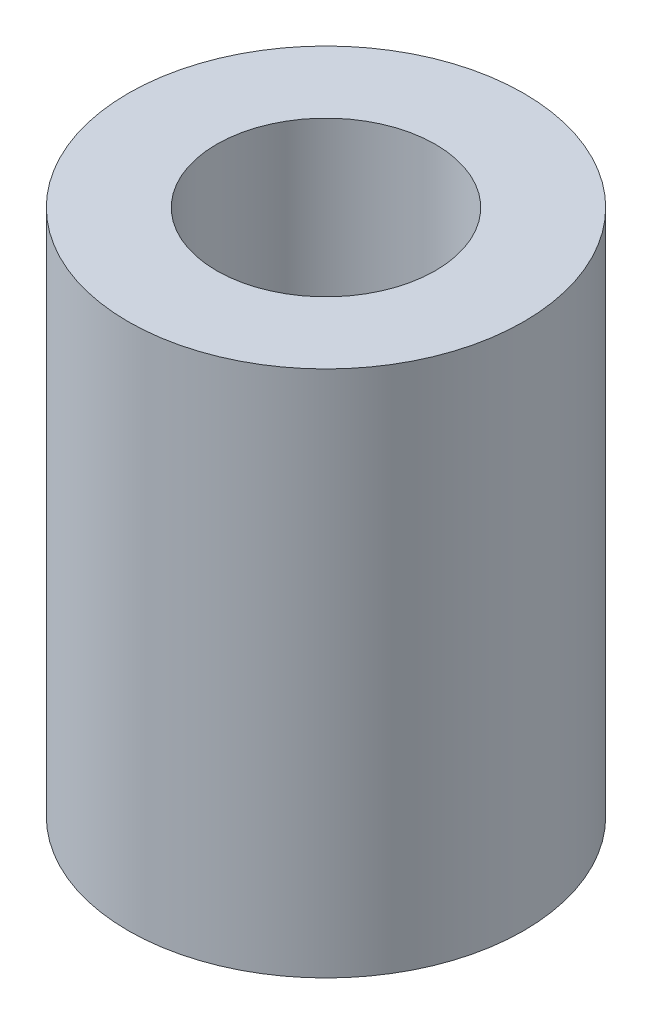
ISO-10303-21;
HEADER;
FILE_DESCRIPTION(('STEP AP214'),'2;1');
FILE_NAME('part.step','',(''),(''),'','','');
FILE_SCHEMA(('AUTOMOTIVE_DESIGN { 1 0 10303 214 1 1 1 1 }'));
ENDSEC;
DATA;
#1=APPLICATION_CONTEXT('core data for automotive mechanical design processes');
#2=APPLICATION_PROTOCOL_DEFINITION('international standard','automotive_design',2000,#1);
#3=PRODUCT_CONTEXT('',#1,'mechanical');
#4=PRODUCT('Part','Part','',(#3));
#5=PRODUCT_RELATED_PRODUCT_CATEGORY('part','',(#4));
#6=PRODUCT_DEFINITION_FORMATION('','',#4);
#7=PRODUCT_DEFINITION_CONTEXT('part definition',#1,'design');
#8=PRODUCT_DEFINITION('design','',#6,#7);
#9=PRODUCT_DEFINITION_SHAPE('','',#8);
#10=(LENGTH_UNIT() NAMED_UNIT(*) SI_UNIT(.MILLI.,.METRE.));
#11=(NAMED_UNIT(*) PLANE_ANGLE_UNIT() SI_UNIT($,.RADIAN.));
#12=(NAMED_UNIT(*) SI_UNIT($,.STERADIAN.) SOLID_ANGLE_UNIT());
#13=UNCERTAINTY_MEASURE_WITH_UNIT(LENGTH_MEASURE(1.E-05),#10,'distance_accuracy_value','');
#14=(GEOMETRIC_REPRESENTATION_CONTEXT(3) GLOBAL_UNCERTAINTY_ASSIGNED_CONTEXT((#13)) GLOBAL_UNIT_ASSIGNED_CONTEXT((#10,
#11,#12)) REPRESENTATION_CONTEXT('',''));
#15=CARTESIAN_POINT('',(0.,0.,0.));
#16=DIRECTION('',(0.,0.,1.));
#17=DIRECTION('',(1.,0.,0.));
#18=AXIS2_PLACEMENT_3D('',#15,#16,#17);
#19=CARTESIAN_POINT('',(0.,20.,0.));
#20=DIRECTION('',(0.,1.,0.));
#21=DIRECTION('',(0.,0.,1.));
#22=AXIS2_PLACEMENT_3D('',#19,#20,#21);
#23=PLANE('',#22);
#24=CARTESIAN_POINT('',(0.,20.,0.));
#25=DIRECTION('',(0.,1.,0.));
#26=DIRECTION('',(0.,0.,1.));
#27=AXIS2_PLACEMENT_3D('',#24,#25,#26);
#28=CIRCLE('',#27,7.5);
#29=CARTESIAN_POINT('',(0.,20.,7.5));
#30=VERTEX_POINT('',#29);
#31=EDGE_CURVE('E10',#30,#30,#28,.T.);
#32=ORIENTED_EDGE('',*,*,#31,.T.);
#33=EDGE_LOOP('',(#32));
#34=FACE_BOUND('',#33,.T.);
#35=CARTESIAN_POINT('',(0.,20.,0.));
#36=DIRECTION('',(0.,1.,0.));
#37=DIRECTION('',(0.,0.,1.));
#38=AXIS2_PLACEMENT_3D('',#35,#36,#37);
#39=CIRCLE('',#38,4.15);
#40=CARTESIAN_POINT('',(0.,20.,4.15));
#41=VERTEX_POINT('',#40);
#42=EDGE_CURVE('E54',#41,#41,#39,.T.);
#43=ORIENTED_EDGE('',*,*,#42,.F.);
#44=EDGE_LOOP('',(#43));
#45=FACE_BOUND('',#44,.T.);
#46=ADVANCED_FACE('F41',(#34,#45),#23,.T.);
#47=CARTESIAN_POINT('',(0.,0.,0.));
#48=DIRECTION('',(0.,1.,0.));
#49=DIRECTION('',(0.,0.,1.));
#50=AXIS2_PLACEMENT_3D('',#47,#48,#49);
#51=PLANE('',#50);
#52=CARTESIAN_POINT('',(0.,0.,0.));
#53=DIRECTION('',(0.,1.,0.));
#54=DIRECTION('',(0.,0.,1.));
#55=AXIS2_PLACEMENT_3D('',#52,#53,#54);
#56=CIRCLE('',#55,7.5);
#57=CARTESIAN_POINT('',(0.,0.,7.5));
#58=VERTEX_POINT('',#57);
#59=EDGE_CURVE('E45',#58,#58,#56,.T.);
#60=ORIENTED_EDGE('',*,*,#59,.F.);
#61=EDGE_LOOP('',(#60));
#62=FACE_BOUND('',#61,.T.);
#63=CARTESIAN_POINT('',(0.,0.,0.));
#64=DIRECTION('',(0.,1.,0.));
#65=DIRECTION('',(0.,0.,1.));
#66=AXIS2_PLACEMENT_3D('',#63,#64,#65);
#67=CIRCLE('',#66,4.15);
#68=CARTESIAN_POINT('',(0.,0.,4.15));
#69=VERTEX_POINT('',#68);
#70=EDGE_CURVE('E56',#69,#69,#67,.T.);
#71=ORIENTED_EDGE('',*,*,#70,.T.);
#72=EDGE_LOOP('',(#71));
#73=FACE_BOUND('',#72,.T.);
#74=ADVANCED_FACE('F68',(#62,#73),#51,.F.);
#75=CARTESIAN_POINT('',(0.,20.,0.));
#76=DIRECTION('',(0.,-1.,0.));
#77=DIRECTION('',(0.,0.,-1.));
#78=AXIS2_PLACEMENT_3D('',#75,#76,#77);
#79=CYLINDRICAL_SURFACE('',#78,7.5);
#80=ORIENTED_EDGE('',*,*,#31,.F.);
#81=EDGE_LOOP('',(#80));
#82=FACE_BOUND('',#81,.T.);
#83=ORIENTED_EDGE('',*,*,#59,.T.);
#84=EDGE_LOOP('',(#83));
#85=FACE_BOUND('',#84,.T.);
#86=ADVANCED_FACE('F43',(#82,#85),#79,.T.);
#87=CARTESIAN_POINT('',(0.,20.,0.));
#88=DIRECTION('',(0.,-1.,0.));
#89=DIRECTION('',(0.,0.,-1.));
#90=AXIS2_PLACEMENT_3D('',#87,#88,#89);
#91=CYLINDRICAL_SURFACE('',#90,4.15);
#92=ORIENTED_EDGE('',*,*,#42,.T.);
#93=EDGE_LOOP('',(#92));
#94=FACE_BOUND('',#93,.T.);
#95=ORIENTED_EDGE('',*,*,#70,.F.);
#96=EDGE_LOOP('',(#95));
#97=FACE_BOUND('',#96,.T.);
#98=ADVANCED_FACE('F64',(#94,#97),#91,.F.);
#99=CLOSED_SHELL('',(#46,#74,#86,#98));
#100=MANIFOLD_SOLID_BREP('B2',#99);
#101=ADVANCED_BREP_SHAPE_REPRESENTATION('',(#18,#100),#14);
#102=SHAPE_DEFINITION_REPRESENTATION(#9,#101);
ENDSEC;
END-ISO-10303-21;
